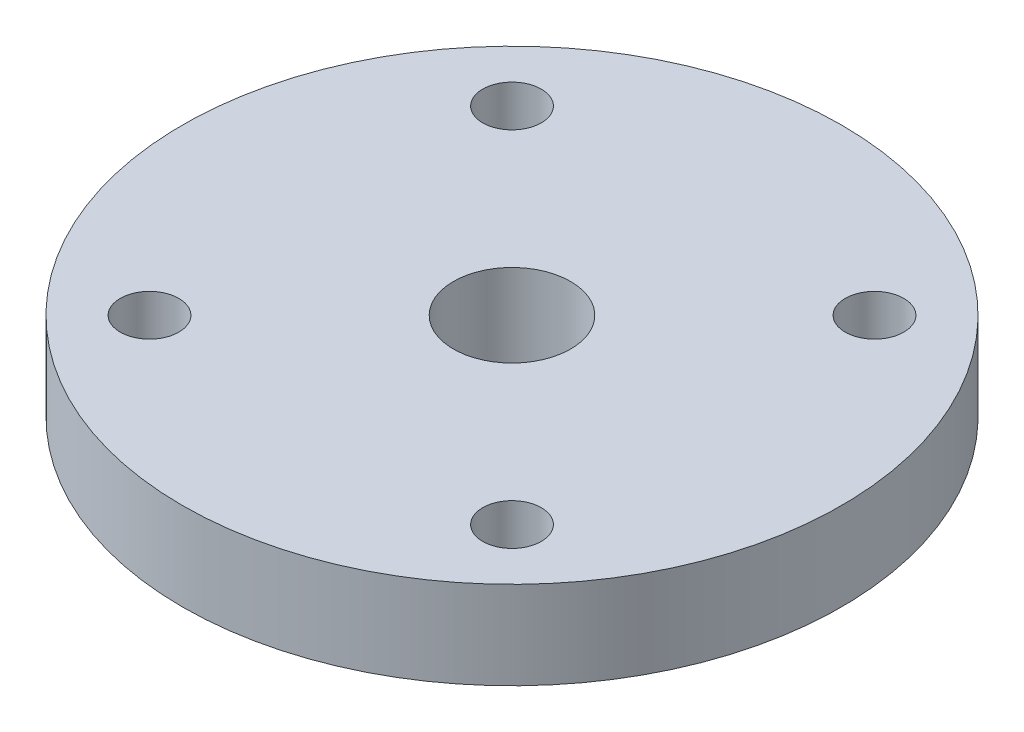
ISO-10303-21;
HEADER;
FILE_DESCRIPTION(('STEP AP214'),'2;1');
FILE_NAME('part.step','',(''),(''),'','','');
FILE_SCHEMA(('AUTOMOTIVE_DESIGN { 1 0 10303 214 1 1 1 1 }'));
ENDSEC;
DATA;
#1=APPLICATION_CONTEXT('core data for automotive mechanical design processes');
#2=APPLICATION_PROTOCOL_DEFINITION('international standard','automotive_design',2000,#1);
#3=PRODUCT_CONTEXT('',#1,'mechanical');
#4=PRODUCT('Part','Part','',(#3));
#5=PRODUCT_RELATED_PRODUCT_CATEGORY('part','',(#4));
#6=PRODUCT_DEFINITION_FORMATION('','',#4);
#7=PRODUCT_DEFINITION_CONTEXT('part definition',#1,'design');
#8=PRODUCT_DEFINITION('design','',#6,#7);
#9=PRODUCT_DEFINITION_SHAPE('','',#8);
#10=(LENGTH_UNIT() NAMED_UNIT(*) SI_UNIT(.MILLI.,.METRE.));
#11=(NAMED_UNIT(*) PLANE_ANGLE_UNIT() SI_UNIT($,.RADIAN.));
#12=(NAMED_UNIT(*) SI_UNIT($,.STERADIAN.) SOLID_ANGLE_UNIT());
#13=UNCERTAINTY_MEASURE_WITH_UNIT(LENGTH_MEASURE(1.E-05),#10,'distance_accuracy_value','');
#14=(GEOMETRIC_REPRESENTATION_CONTEXT(3) GLOBAL_UNCERTAINTY_ASSIGNED_CONTEXT((#13)) GLOBAL_UNIT_ASSIGNED_CONTEXT((#10,
#11,#12)) REPRESENTATION_CONTEXT('',''));
#15=CARTESIAN_POINT('',(0.,0.,0.));
#16=DIRECTION('',(0.,0.,1.));
#17=DIRECTION('',(1.,0.,0.));
#18=AXIS2_PLACEMENT_3D('',#15,#16,#17);
#19=CARTESIAN_POINT('',(0.,2.,0.));
#20=DIRECTION('',(0.,-1.,0.));
#21=DIRECTION('',(0.,0.,-1.));
#22=AXIS2_PLACEMENT_3D('',#19,#20,#21);
#23=CYLINDRICAL_SURFACE('',#22,12.5);
#24=CARTESIAN_POINT('',(0.,0.,0.));
#25=DIRECTION('',(0.,1.,0.));
#26=DIRECTION('',(0.,0.,1.));
#27=AXIS2_PLACEMENT_3D('',#24,#25,#26);
#28=CIRCLE('',#27,12.5);
#29=CARTESIAN_POINT('',(11.5,0.,-4.89897948556635));
#30=VERTEX_POINT('',#29);
#31=CARTESIAN_POINT('',(-11.5,0.,-4.89897948556637));
#32=VERTEX_POINT('',#31);
#33=EDGE_CURVE('E111',#30,#32,#28,.T.);
#34=ORIENTED_EDGE('',*,*,#33,.T.);
#35=DIRECTION('',(0.,-1.,0.));
#36=VECTOR('',#35,1.);
#37=CARTESIAN_POINT('',(-11.5,2.,-4.89897948556637));
#38=LINE('',#37,#36);
#39=CARTESIAN_POINT('',(-11.5,2.,-4.89897948556637));
#40=VERTEX_POINT('',#39);
#41=EDGE_CURVE('E11',#40,#32,#38,.T.);
#42=ORIENTED_EDGE('',*,*,#41,.F.);
#43=CARTESIAN_POINT('',(0.,2.,0.));
#44=DIRECTION('',(0.,1.,0.));
#45=DIRECTION('',(0.,0.,1.));
#46=AXIS2_PLACEMENT_3D('',#43,#44,#45);
#47=CIRCLE('',#46,12.5);
#48=CARTESIAN_POINT('',(11.5,2.,-4.89897948556635));
#49=VERTEX_POINT('',#48);
#50=EDGE_CURVE('E90',#49,#40,#47,.T.);
#51=ORIENTED_EDGE('',*,*,#50,.F.);
#52=DIRECTION('',(0.,-1.,0.));
#53=VECTOR('',#52,1.);
#54=CARTESIAN_POINT('',(11.5,2.,-4.89897948556635));
#55=LINE('',#54,#53);
#56=EDGE_CURVE('E92',#49,#30,#55,.T.);
#57=ORIENTED_EDGE('',*,*,#56,.T.);
#58=EDGE_LOOP('',(#34,#42,#51,#57));
#59=FACE_BOUND('',#58,.T.);
#60=ADVANCED_FACE('F38',(#59),#23,.T.);
#61=CARTESIAN_POINT('',(-11.5,2.,4.89897948556638));
#62=DIRECTION('',(1.,0.,0.));
#63=DIRECTION('',(0.,0.,-1.));
#64=AXIS2_PLACEMENT_3D('',#61,#62,#63);
#65=PLANE('',#64);
#66=DIRECTION('',(0.,0.,1.));
#67=VECTOR('',#66,1.);
#68=CARTESIAN_POINT('',(-11.5,0.,4.89897948556638));
#69=LINE('',#68,#67);
#70=CARTESIAN_POINT('',(-11.5,0.,4.89897948556638));
#71=VERTEX_POINT('',#70);
#72=EDGE_CURVE('E114',#32,#71,#69,.T.);
#73=ORIENTED_EDGE('',*,*,#72,.T.);
#74=DIRECTION('',(0.,-1.,0.));
#75=VECTOR('',#74,1.);
#76=CARTESIAN_POINT('',(-11.5,2.,4.89897948556638));
#77=LINE('',#76,#75);
#78=CARTESIAN_POINT('',(-11.5,2.,4.89897948556638));
#79=VERTEX_POINT('',#78);
#80=EDGE_CURVE('E46',#79,#71,#77,.T.);
#81=ORIENTED_EDGE('',*,*,#80,.F.);
#82=DIRECTION('',(0.,0.,1.));
#83=VECTOR('',#82,1.);
#84=CARTESIAN_POINT('',(-11.5,2.,4.89897948556638));
#85=LINE('',#84,#83);
#86=EDGE_CURVE('E84',#40,#79,#85,.T.);
#87=ORIENTED_EDGE('',*,*,#86,.F.);
#88=ORIENTED_EDGE('',*,*,#41,.T.);
#89=EDGE_LOOP('',(#73,#81,#87,#88));
#90=FACE_BOUND('',#89,.T.);
#91=ADVANCED_FACE('F125',(#90),#65,.F.);
#92=CARTESIAN_POINT('',(0.,2.,0.));
#93=DIRECTION('',(0.,-1.,0.));
#94=DIRECTION('',(0.,0.,-1.));
#95=AXIS2_PLACEMENT_3D('',#92,#93,#94);
#96=CYLINDRICAL_SURFACE('',#95,12.5);
#97=CARTESIAN_POINT('',(0.,0.,0.));
#98=DIRECTION('',(0.,1.,0.));
#99=DIRECTION('',(0.,0.,1.));
#100=AXIS2_PLACEMENT_3D('',#97,#98,#99);
#101=CIRCLE('',#100,12.5);
#102=CARTESIAN_POINT('',(11.5,0.,4.89897948556635));
#103=VERTEX_POINT('',#102);
#104=EDGE_CURVE('E74',#71,#103,#101,.T.);
#105=ORIENTED_EDGE('',*,*,#104,.T.);
#106=DIRECTION('',(0.,-1.,0.));
#107=VECTOR('',#106,1.);
#108=CARTESIAN_POINT('',(11.5,2.,4.89897948556635));
#109=LINE('',#108,#107);
#110=CARTESIAN_POINT('',(11.5,2.,4.89897948556635));
#111=VERTEX_POINT('',#110);
#112=EDGE_CURVE('E56',#111,#103,#109,.T.);
#113=ORIENTED_EDGE('',*,*,#112,.F.);
#114=CARTESIAN_POINT('',(0.,2.,0.));
#115=DIRECTION('',(0.,1.,0.));
#116=DIRECTION('',(0.,0.,1.));
#117=AXIS2_PLACEMENT_3D('',#114,#115,#116);
#118=CIRCLE('',#117,12.5);
#119=EDGE_CURVE('E104',#79,#111,#118,.T.);
#120=ORIENTED_EDGE('',*,*,#119,.F.);
#121=ORIENTED_EDGE('',*,*,#80,.T.);
#122=EDGE_LOOP('',(#105,#113,#120,#121));
#123=FACE_BOUND('',#122,.T.);
#124=ADVANCED_FACE('F122',(#123),#96,.T.);
#125=CARTESIAN_POINT('',(11.5,2.,4.89897948556635));
#126=DIRECTION('',(-1.,0.,0.));
#127=DIRECTION('',(0.,0.,1.));
#128=AXIS2_PLACEMENT_3D('',#125,#126,#127);
#129=PLANE('',#128);
#130=DIRECTION('',(0.,0.,-1.));
#131=VECTOR('',#130,1.);
#132=CARTESIAN_POINT('',(11.5,0.,4.89897948556635));
#133=LINE('',#132,#131);
#134=EDGE_CURVE('E79',#103,#30,#133,.T.);
#135=ORIENTED_EDGE('',*,*,#134,.T.);
#136=ORIENTED_EDGE('',*,*,#56,.F.);
#137=DIRECTION('',(0.,0.,-1.));
#138=VECTOR('',#137,1.);
#139=CARTESIAN_POINT('',(11.5,2.,4.89897948556635));
#140=LINE('',#139,#138);
#141=EDGE_CURVE('E99',#111,#49,#140,.T.);
#142=ORIENTED_EDGE('',*,*,#141,.F.);
#143=ORIENTED_EDGE('',*,*,#112,.T.);
#144=EDGE_LOOP('',(#135,#136,#142,#143));
#145=FACE_BOUND('',#144,.T.);
#146=ADVANCED_FACE('F98',(#145),#129,.F.);
#147=CARTESIAN_POINT('',(0.,0.,0.));
#148=DIRECTION('',(0.,1.,0.));
#149=DIRECTION('',(0.,0.,1.));
#150=AXIS2_PLACEMENT_3D('',#147,#148,#149);
#151=PLANE('',#150);
#152=CARTESIAN_POINT('',(0.,0.,0.));
#153=DIRECTION('',(0.,-1.,0.));
#154=DIRECTION('',(0.,0.,-1.));
#155=AXIS2_PLACEMENT_3D('',#152,#153,#154);
#156=CIRCLE('',#155,4.);
#157=CARTESIAN_POINT('',(0.,0.,-4.));
#158=VERTEX_POINT('',#157);
#159=EDGE_CURVE('E176',#158,#158,#156,.T.);
#160=ORIENTED_EDGE('',*,*,#159,.F.);
#161=EDGE_LOOP('',(#160));
#162=FACE_BOUND('',#161,.T.);
#163=ORIENTED_EDGE('',*,*,#33,.F.);
#164=ORIENTED_EDGE('',*,*,#134,.F.);
#165=ORIENTED_EDGE('',*,*,#104,.F.);
#166=ORIENTED_EDGE('',*,*,#72,.F.);
#167=EDGE_LOOP('',(#163,#164,#165,#166));
#168=FACE_BOUND('',#167,.T.);
#169=ADVANCED_FACE('F124',(#162,#168),#151,.F.);
#170=CARTESIAN_POINT('',(0.,2.,0.));
#171=DIRECTION('',(0.,1.,0.));
#172=DIRECTION('',(0.,0.,1.));
#173=AXIS2_PLACEMENT_3D('',#170,#171,#172);
#174=PLANE('',#173);
#175=CARTESIAN_POINT('',(12.3743686707653,2.,-12.3743686707646));
#176=DIRECTION('',(0.,-1.,0.));
#177=DIRECTION('',(0.,0.,-1.));
#178=AXIS2_PLACEMENT_3D('',#175,#176,#177);
#179=CIRCLE('',#178,1.99999999999937);
#180=CARTESIAN_POINT('',(12.3743686707653,2.,-14.3743686707639));
#181=VERTEX_POINT('',#180);
#182=EDGE_CURVE('E188',#181,#181,#179,.T.);
#183=ORIENTED_EDGE('',*,*,#182,.F.);
#184=EDGE_LOOP('',(#183));
#185=FACE_BOUND('',#184,.T.);
#186=CARTESIAN_POINT('',(12.3743686707646,2.,12.3743686707646));
#187=DIRECTION('',(0.,-1.,0.));
#188=DIRECTION('',(0.,0.,-1.));
#189=AXIS2_PLACEMENT_3D('',#186,#187,#188);
#190=CIRCLE('',#189,2.);
#191=CARTESIAN_POINT('',(12.3743686707646,2.,10.3743686707646));
#192=VERTEX_POINT('',#191);
#193=EDGE_CURVE('E195',#192,#192,#190,.T.);
#194=ORIENTED_EDGE('',*,*,#193,.F.);
#195=EDGE_LOOP('',(#194));
#196=FACE_BOUND('',#195,.T.);
#197=CARTESIAN_POINT('',(-12.3743686707646,2.,12.3743686707639));
#198=DIRECTION('',(0.,-1.,0.));
#199=DIRECTION('',(0.,0.,-1.));
#200=AXIS2_PLACEMENT_3D('',#197,#198,#199);
#201=CIRCLE('',#200,2.00000000000027);
#202=CARTESIAN_POINT('',(-12.3743686707646,2.,10.3743686707636));
#203=VERTEX_POINT('',#202);
#204=EDGE_CURVE('E180',#203,#203,#201,.T.);
#205=ORIENTED_EDGE('',*,*,#204,.F.);
#206=EDGE_LOOP('',(#205));
#207=FACE_BOUND('',#206,.T.);
#208=CARTESIAN_POINT('',(-12.3743686707639,2.,-12.3743686707653));
#209=DIRECTION('',(0.,-1.,0.));
#210=DIRECTION('',(0.,0.,-1.));
#211=AXIS2_PLACEMENT_3D('',#208,#209,#210);
#212=CIRCLE('',#211,1.99999999999968);
#213=CARTESIAN_POINT('',(-12.3743686707639,2.,-14.374368670765));
#214=VERTEX_POINT('',#213);
#215=EDGE_CURVE('E187',#214,#214,#212,.T.);
#216=ORIENTED_EDGE('',*,*,#215,.F.);
#217=EDGE_LOOP('',(#216));
#218=FACE_BOUND('',#217,.T.);
#219=CARTESIAN_POINT('',(0.,2.,0.));
#220=DIRECTION('',(0.,1.,0.));
#221=DIRECTION('',(0.,0.,1.));
#222=AXIS2_PLACEMENT_3D('',#219,#220,#221);
#223=CIRCLE('',#222,22.5);
#224=CARTESIAN_POINT('',(0.,2.,22.5));
#225=VERTEX_POINT('',#224);
#226=EDGE_CURVE('E207',#225,#225,#223,.T.);
#227=ORIENTED_EDGE('',*,*,#226,.F.);
#228=EDGE_LOOP('',(#227));
#229=FACE_BOUND('',#228,.T.);
#230=ORIENTED_EDGE('',*,*,#141,.T.);
#231=ORIENTED_EDGE('',*,*,#50,.T.);
#232=ORIENTED_EDGE('',*,*,#86,.T.);
#233=ORIENTED_EDGE('',*,*,#119,.T.);
#234=EDGE_LOOP('',(#230,#231,#232,#233));
#235=FACE_BOUND('',#234,.T.);
#236=ADVANCED_FACE('F103',(#185,#196,#207,#218,#229,#235),#174,.F.);
#237=CARTESIAN_POINT('',(0.,8.,0.));
#238=DIRECTION('',(0.,-1.,0.));
#239=DIRECTION('',(0.,0.,-1.));
#240=AXIS2_PLACEMENT_3D('',#237,#238,#239);
#241=CYLINDRICAL_SURFACE('',#240,22.5);
#242=CARTESIAN_POINT('',(0.,8.,0.));
#243=DIRECTION('',(0.,1.,0.));
#244=DIRECTION('',(0.,0.,1.));
#245=AXIS2_PLACEMENT_3D('',#242,#243,#244);
#246=CIRCLE('',#245,22.5);
#247=CARTESIAN_POINT('',(0.,8.,22.5));
#248=VERTEX_POINT('',#247);
#249=EDGE_CURVE('E115',#248,#248,#246,.T.);
#250=ORIENTED_EDGE('',*,*,#249,.F.);
#251=EDGE_LOOP('',(#250));
#252=FACE_BOUND('',#251,.T.);
#253=ORIENTED_EDGE('',*,*,#226,.T.);
#254=EDGE_LOOP('',(#253));
#255=FACE_BOUND('',#254,.T.);
#256=ADVANCED_FACE('F138',(#252,#255),#241,.T.);
#257=CARTESIAN_POINT('',(0.,8.,0.));
#258=DIRECTION('',(0.,1.,0.));
#259=DIRECTION('',(0.,0.,1.));
#260=AXIS2_PLACEMENT_3D('',#257,#258,#259);
#261=PLANE('',#260);
#262=CARTESIAN_POINT('',(0.,8.,0.));
#263=DIRECTION('',(0.,-1.,0.));
#264=DIRECTION('',(0.,0.,-1.));
#265=AXIS2_PLACEMENT_3D('',#262,#263,#264);
#266=CIRCLE('',#265,4.);
#267=CARTESIAN_POINT('',(0.,8.,-4.));
#268=VERTEX_POINT('',#267);
#269=EDGE_CURVE('E173',#268,#268,#266,.T.);
#270=ORIENTED_EDGE('',*,*,#269,.T.);
#271=EDGE_LOOP('',(#270));
#272=FACE_BOUND('',#271,.T.);
#273=CARTESIAN_POINT('',(12.3743686707653,8.,-12.3743686707646));
#274=DIRECTION('',(0.,-1.,0.));
#275=DIRECTION('',(0.,0.,-1.));
#276=AXIS2_PLACEMENT_3D('',#273,#274,#275);
#277=CIRCLE('',#276,1.99999999999937);
#278=CARTESIAN_POINT('',(12.3743686707653,8.,-14.3743686707639));
#279=VERTEX_POINT('',#278);
#280=EDGE_CURVE('E183',#279,#279,#277,.T.);
#281=ORIENTED_EDGE('',*,*,#280,.T.);
#282=EDGE_LOOP('',(#281));
#283=FACE_BOUND('',#282,.T.);
#284=CARTESIAN_POINT('',(12.3743686707646,8.,12.3743686707646));
#285=DIRECTION('',(0.,-1.,0.));
#286=DIRECTION('',(0.,0.,-1.));
#287=AXIS2_PLACEMENT_3D('',#284,#285,#286);
#288=CIRCLE('',#287,2.);
#289=CARTESIAN_POINT('',(12.3743686707646,8.,10.3743686707646));
#290=VERTEX_POINT('',#289);
#291=EDGE_CURVE('E192',#290,#290,#288,.T.);
#292=ORIENTED_EDGE('',*,*,#291,.T.);
#293=EDGE_LOOP('',(#292));
#294=FACE_BOUND('',#293,.T.);
#295=CARTESIAN_POINT('',(-12.3743686707646,8.,12.3743686707639));
#296=DIRECTION('',(0.,-1.,0.));
#297=DIRECTION('',(0.,0.,-1.));
#298=AXIS2_PLACEMENT_3D('',#295,#296,#297);
#299=CIRCLE('',#298,2.00000000000027);
#300=CARTESIAN_POINT('',(-12.3743686707646,8.,10.3743686707636));
#301=VERTEX_POINT('',#300);
#302=EDGE_CURVE('E198',#301,#301,#299,.T.);
#303=ORIENTED_EDGE('',*,*,#302,.T.);
#304=EDGE_LOOP('',(#303));
#305=FACE_BOUND('',#304,.T.);
#306=CARTESIAN_POINT('',(-12.3743686707639,8.,-12.3743686707653));
#307=DIRECTION('',(0.,-1.,0.));
#308=DIRECTION('',(0.,0.,-1.));
#309=AXIS2_PLACEMENT_3D('',#306,#307,#308);
#310=CIRCLE('',#309,1.99999999999968);
#311=CARTESIAN_POINT('',(-12.3743686707639,8.,-14.374368670765));
#312=VERTEX_POINT('',#311);
#313=EDGE_CURVE('E204',#312,#312,#310,.T.);
#314=ORIENTED_EDGE('',*,*,#313,.T.);
#315=EDGE_LOOP('',(#314));
#316=FACE_BOUND('',#315,.T.);
#317=ORIENTED_EDGE('',*,*,#249,.T.);
#318=EDGE_LOOP('',(#317));
#319=FACE_BOUND('',#318,.T.);
#320=ADVANCED_FACE('F141',(#272,#283,#294,#305,#316,#319),#261,.T.);
#321=CARTESIAN_POINT('',(-12.3743686707639,8.,-12.3743686707653));
#322=DIRECTION('',(0.,-1.,0.));
#323=DIRECTION('',(0.,0.,-1.));
#324=AXIS2_PLACEMENT_3D('',#321,#322,#323);
#325=CYLINDRICAL_SURFACE('',#324,1.99999999999968);
#326=ORIENTED_EDGE('',*,*,#313,.F.);
#327=EDGE_LOOP('',(#326));
#328=FACE_BOUND('',#327,.T.);
#329=ORIENTED_EDGE('',*,*,#215,.T.);
#330=EDGE_LOOP('',(#329));
#331=FACE_BOUND('',#330,.T.);
#332=ADVANCED_FACE('F148',(#328,#331),#325,.F.);
#333=CARTESIAN_POINT('',(-12.3743686707646,8.,12.3743686707639));
#334=DIRECTION('',(0.,-1.,0.));
#335=DIRECTION('',(0.,0.,-1.));
#336=AXIS2_PLACEMENT_3D('',#333,#334,#335);
#337=CYLINDRICAL_SURFACE('',#336,2.00000000000027);
#338=ORIENTED_EDGE('',*,*,#302,.F.);
#339=EDGE_LOOP('',(#338));
#340=FACE_BOUND('',#339,.T.);
#341=ORIENTED_EDGE('',*,*,#204,.T.);
#342=EDGE_LOOP('',(#341));
#343=FACE_BOUND('',#342,.T.);
#344=ADVANCED_FACE('F152',(#340,#343),#337,.F.);
#345=CARTESIAN_POINT('',(12.3743686707646,8.,12.3743686707646));
#346=DIRECTION('',(0.,-1.,0.));
#347=DIRECTION('',(0.,0.,-1.));
#348=AXIS2_PLACEMENT_3D('',#345,#346,#347);
#349=CYLINDRICAL_SURFACE('',#348,2.);
#350=ORIENTED_EDGE('',*,*,#291,.F.);
#351=EDGE_LOOP('',(#350));
#352=FACE_BOUND('',#351,.T.);
#353=ORIENTED_EDGE('',*,*,#193,.T.);
#354=EDGE_LOOP('',(#353));
#355=FACE_BOUND('',#354,.T.);
#356=ADVANCED_FACE('F156',(#352,#355),#349,.F.);
#357=CARTESIAN_POINT('',(12.3743686707653,8.,-12.3743686707646));
#358=DIRECTION('',(0.,-1.,0.));
#359=DIRECTION('',(0.,0.,-1.));
#360=AXIS2_PLACEMENT_3D('',#357,#358,#359);
#361=CYLINDRICAL_SURFACE('',#360,1.99999999999937);
#362=ORIENTED_EDGE('',*,*,#280,.F.);
#363=EDGE_LOOP('',(#362));
#364=FACE_BOUND('',#363,.T.);
#365=ORIENTED_EDGE('',*,*,#182,.T.);
#366=EDGE_LOOP('',(#365));
#367=FACE_BOUND('',#366,.T.);
#368=ADVANCED_FACE('F160',(#364,#367),#361,.F.);
#369=CARTESIAN_POINT('',(0.,8.,0.));
#370=DIRECTION('',(0.,-1.,0.));
#371=DIRECTION('',(0.,0.,-1.));
#372=AXIS2_PLACEMENT_3D('',#369,#370,#371);
#373=CYLINDRICAL_SURFACE('',#372,4.);
#374=ORIENTED_EDGE('',*,*,#269,.F.);
#375=EDGE_LOOP('',(#374));
#376=FACE_BOUND('',#375,.T.);
#377=ORIENTED_EDGE('',*,*,#159,.T.);
#378=EDGE_LOOP('',(#377));
#379=FACE_BOUND('',#378,.T.);
#380=ADVANCED_FACE('F164',(#376,#379),#373,.F.);
#381=CLOSED_SHELL('',(#60,#91,#124,#146,#169,#236,#256,#320,#332,#344,#356,#368,#380));
#382=MANIFOLD_SOLID_BREP('B2',#381);
#383=ADVANCED_BREP_SHAPE_REPRESENTATION('',(#18,#382),#14);
#384=SHAPE_DEFINITION_REPRESENTATION(#9,#383);
ENDSEC;
END-ISO-10303-21;
